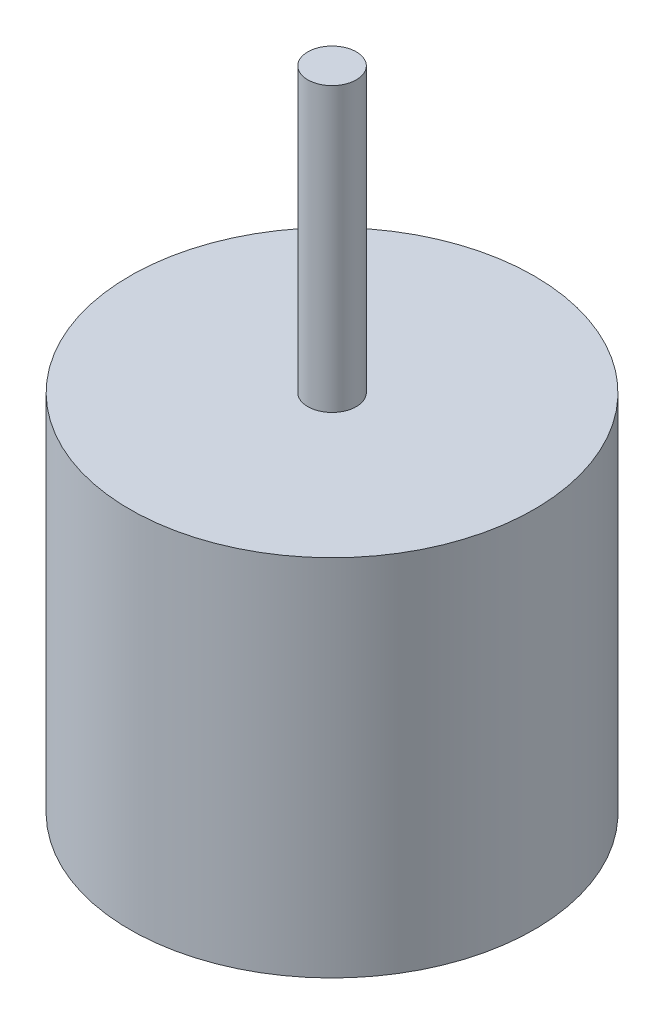
ISO-10303-21;
HEADER;
FILE_DESCRIPTION(('STEP AP214'),'2;1');
FILE_NAME('part.step','',(''),(''),'','','');
FILE_SCHEMA(('AUTOMOTIVE_DESIGN { 1 0 10303 214 1 1 1 1 }'));
ENDSEC;
DATA;
#1=APPLICATION_CONTEXT('core data for automotive mechanical design processes');
#2=APPLICATION_PROTOCOL_DEFINITION('international standard','automotive_design',2000,#1);
#3=PRODUCT_CONTEXT('',#1,'mechanical');
#4=PRODUCT('Part','Part','',(#3));
#5=PRODUCT_RELATED_PRODUCT_CATEGORY('part','',(#4));
#6=PRODUCT_DEFINITION_FORMATION('','',#4);
#7=PRODUCT_DEFINITION_CONTEXT('part definition',#1,'design');
#8=PRODUCT_DEFINITION('design','',#6,#7);
#9=PRODUCT_DEFINITION_SHAPE('','',#8);
#10=(LENGTH_UNIT() NAMED_UNIT(*) SI_UNIT(.MILLI.,.METRE.));
#11=(NAMED_UNIT(*) PLANE_ANGLE_UNIT() SI_UNIT($,.RADIAN.));
#12=(NAMED_UNIT(*) SI_UNIT($,.STERADIAN.) SOLID_ANGLE_UNIT());
#13=UNCERTAINTY_MEASURE_WITH_UNIT(LENGTH_MEASURE(1.E-05),#10,'distance_accuracy_value','');
#14=(GEOMETRIC_REPRESENTATION_CONTEXT(3) GLOBAL_UNCERTAINTY_ASSIGNED_CONTEXT((#13)) GLOBAL_UNIT_ASSIGNED_CONTEXT((#10,
#11,#12)) REPRESENTATION_CONTEXT('',''));
#15=CARTESIAN_POINT('',(0.,0.,0.));
#16=DIRECTION('',(0.,0.,1.));
#17=DIRECTION('',(1.,0.,0.));
#18=AXIS2_PLACEMENT_3D('',#15,#16,#17);
#19=CARTESIAN_POINT('',(0.,45.,0.));
#20=DIRECTION('',(0.,-1.,0.));
#21=DIRECTION('',(0.,0.,-1.));
#22=AXIS2_PLACEMENT_3D('',#19,#20,#21);
#23=CYLINDRICAL_SURFACE('',#22,25.);
#24=CARTESIAN_POINT('',(0.,45.,0.));
#25=DIRECTION('',(0.,1.,0.));
#26=DIRECTION('',(0.,0.,1.));
#27=AXIS2_PLACEMENT_3D('',#24,#25,#26);
#28=CIRCLE('',#27,25.);
#29=CARTESIAN_POINT('',(0.,45.,-25.));
#30=VERTEX_POINT('',#29);
#31=EDGE_CURVE('E10',#30,#30,#28,.T.);
#32=CARTESIAN_POINT('',(0.,0.,0.));
#33=DIRECTION('',(0.,1.,0.));
#34=DIRECTION('',(0.,0.,1.));
#35=AXIS2_PLACEMENT_3D('',#32,#33,#34);
#36=CIRCLE('',#35,25.);
#37=CARTESIAN_POINT('',(0.,0.,-25.));
#38=VERTEX_POINT('',#37);
#39=EDGE_CURVE('E40',#38,#38,#36,.T.);
#40=CARTESIAN_POINT('',(0.,45.,-25.));
#41=CARTESIAN_POINT('',(0.,44.53125,-25.));
#42=CARTESIAN_POINT('',(0.,44.0625,-25.));
#43=CARTESIAN_POINT('',(0.,43.125,-25.));
#44=CARTESIAN_POINT('',(0.,42.65625,-25.));
#45=CARTESIAN_POINT('',(0.,41.71875,-25.));
#46=CARTESIAN_POINT('',(0.,41.25,-25.));
#47=CARTESIAN_POINT('',(0.,40.3125,-25.));
#48=CARTESIAN_POINT('',(0.,39.84375,-25.));
#49=CARTESIAN_POINT('',(0.,38.90625,-25.));
#50=CARTESIAN_POINT('',(0.,38.4375,-25.));
#51=CARTESIAN_POINT('',(0.,37.5,-25.));
#52=CARTESIAN_POINT('',(0.,37.03125,-25.));
#53=CARTESIAN_POINT('',(0.,36.09375,-25.));
#54=CARTESIAN_POINT('',(0.,35.625,-25.));
#55=CARTESIAN_POINT('',(0.,34.6875,-25.));
#56=CARTESIAN_POINT('',(0.,34.21875,-25.));
#57=CARTESIAN_POINT('',(0.,33.28125,-25.));
#58=CARTESIAN_POINT('',(0.,32.8125,-25.));
#59=CARTESIAN_POINT('',(0.,31.875,-25.));
#60=CARTESIAN_POINT('',(0.,31.40625,-25.));
#61=CARTESIAN_POINT('',(0.,30.46875,-25.));
#62=CARTESIAN_POINT('',(0.,30.,-25.));
#63=CARTESIAN_POINT('',(0.,29.0625,-25.));
#64=CARTESIAN_POINT('',(0.,28.59375,-25.));
#65=CARTESIAN_POINT('',(0.,27.65625,-25.));
#66=CARTESIAN_POINT('',(0.,27.1875,-25.));
#67=CARTESIAN_POINT('',(0.,26.25,-25.));
#68=CARTESIAN_POINT('',(0.,25.78125,-25.));
#69=CARTESIAN_POINT('',(0.,24.84375,-25.));
#70=CARTESIAN_POINT('',(0.,24.375,-25.));
#71=CARTESIAN_POINT('',(0.,23.4375,-25.));
#72=CARTESIAN_POINT('',(0.,22.96875,-25.));
#73=CARTESIAN_POINT('',(0.,22.03125,-25.));
#74=CARTESIAN_POINT('',(0.,21.5625,-25.));
#75=CARTESIAN_POINT('',(0.,20.625,-25.));
#76=CARTESIAN_POINT('',(0.,20.15625,-25.));
#77=CARTESIAN_POINT('',(0.,19.21875,-25.));
#78=CARTESIAN_POINT('',(0.,18.75,-25.));
#79=CARTESIAN_POINT('',(0.,17.8125,-25.));
#80=CARTESIAN_POINT('',(0.,17.34375,-25.));
#81=CARTESIAN_POINT('',(0.,16.40625,-25.));
#82=CARTESIAN_POINT('',(0.,15.9375,-25.));
#83=CARTESIAN_POINT('',(0.,15.,-25.));
#84=CARTESIAN_POINT('',(0.,14.53125,-25.));
#85=CARTESIAN_POINT('',(0.,13.59375,-25.));
#86=CARTESIAN_POINT('',(0.,13.125,-25.));
#87=CARTESIAN_POINT('',(0.,12.1875,-25.));
#88=CARTESIAN_POINT('',(0.,11.71875,-25.));
#89=CARTESIAN_POINT('',(0.,10.78125,-25.));
#90=CARTESIAN_POINT('',(0.,10.3125,-25.));
#91=CARTESIAN_POINT('',(0.,9.37499999999999,-25.));
#92=CARTESIAN_POINT('',(0.,8.90624999999999,-25.));
#93=CARTESIAN_POINT('',(0.,7.96874999999999,-25.));
#94=CARTESIAN_POINT('',(0.,7.5,-25.));
#95=CARTESIAN_POINT('',(0.,6.56249999999999,-25.));
#96=CARTESIAN_POINT('',(0.,6.09374999999999,-25.));
#97=CARTESIAN_POINT('',(0.,5.15624999999999,-25.));
#98=CARTESIAN_POINT('',(0.,4.68749999999999,-25.));
#99=CARTESIAN_POINT('',(0.,3.74999999999999,-25.));
#100=CARTESIAN_POINT('',(0.,3.28124999999999,-25.));
#101=CARTESIAN_POINT('',(0.,2.34374999999999,-25.));
#102=CARTESIAN_POINT('',(0.,1.87499999999999,-25.));
#103=CARTESIAN_POINT('',(0.,0.937499999999992,-25.));
#104=CARTESIAN_POINT('',(0.,0.468749999999993,-25.));
#105=CARTESIAN_POINT('',(0.,0.,-25.));
#106=B_SPLINE_CURVE_WITH_KNOTS('',3,(#40,#41,#42,#43,#44,#45,#46,#47,#48,#49,#50,#51,#52,#53,
#54,#55,#56,#57,#58,#59,#60,#61,#62,#63,#64,#65,#66,#67,#68,#69,#70,#71,#72,#73,#74,#75,#76,#77,
#78,#79,#80,#81,#82,#83,#84,#85,#86,#87,#88,#89,#90,#91,#92,#93,#94,#95,#96,#97,#98,#99,#100,
#101,#102,#103,#104,#105),.UNSPECIFIED.,.F.,.F.,(4,2,2,2,2,2,2,2,2,2,2,2,2,2,2,2,2,2,2,2,2,2,2,
2,2,2,2,2,2,2,2,2,4),(0.,1.40625,2.8125,4.21874999999999,5.625,7.03125,8.43749999999999,9.84375,
11.25,12.65625,14.0625,15.46875,16.875,18.28125,19.6875,21.09375,22.5,23.90625,25.3125,26.71875,
28.125,29.53125,30.9375,32.34375,33.75,35.15625,36.5625,37.96875,39.375,40.78125,42.1875,
43.59375,45.),.UNSPECIFIED.);
#107=EDGE_CURVE('BSEAM37',#30,#38,#106,.T.);
#108=ORIENTED_EDGE('',*,*,#31,.F.);
#109=ORIENTED_EDGE('',*,*,#39,.T.);
#110=ORIENTED_EDGE('',*,*,#107,.T.);
#111=ORIENTED_EDGE('',*,*,#107,.F.);
#112=EDGE_LOOP('',(#108,#110,#109,#111));
#113=FACE_BOUND('',#112,.T.);
#114=ADVANCED_FACE('F37',(#113),#23,.T.);
#115=CARTESIAN_POINT('',(0.,45.,0.));
#116=DIRECTION('',(0.,1.,0.));
#117=DIRECTION('',(0.,0.,1.));
#118=AXIS2_PLACEMENT_3D('',#115,#116,#117);
#119=PLANE('',#118);
#120=CARTESIAN_POINT('',(0.,45.,0.));
#121=DIRECTION('',(0.,1.,0.));
#122=DIRECTION('',(0.,0.,1.));
#123=AXIS2_PLACEMENT_3D('',#120,#121,#122);
#124=CIRCLE('',#123,3.);
#125=CARTESIAN_POINT('',(0.,45.,3.));
#126=VERTEX_POINT('',#125);
#127=EDGE_CURVE('E49',#126,#126,#124,.T.);
#128=ORIENTED_EDGE('',*,*,#127,.F.);
#129=EDGE_LOOP('',(#128));
#130=FACE_BOUND('',#129,.T.);
#131=ORIENTED_EDGE('',*,*,#31,.T.);
#132=EDGE_LOOP('',(#131));
#133=FACE_BOUND('',#132,.T.);
#134=ADVANCED_FACE('F64',(#130,#133),#119,.T.);
#135=CARTESIAN_POINT('',(0.,0.,0.));
#136=DIRECTION('',(0.,1.,0.));
#137=DIRECTION('',(0.,0.,1.));
#138=AXIS2_PLACEMENT_3D('',#135,#136,#137);
#139=PLANE('',#138);
#140=ORIENTED_EDGE('',*,*,#39,.F.);
#141=EDGE_LOOP('',(#140));
#142=FACE_BOUND('',#141,.T.);
#143=ADVANCED_FACE('F60',(#142),#139,.F.);
#144=CARTESIAN_POINT('',(0.,80.,0.));
#145=DIRECTION('',(0.,-1.,0.));
#146=DIRECTION('',(0.,0.,-1.));
#147=AXIS2_PLACEMENT_3D('',#144,#145,#146);
#148=CYLINDRICAL_SURFACE('',#147,3.);
#149=CARTESIAN_POINT('',(0.,80.,0.));
#150=DIRECTION('',(0.,1.,0.));
#151=DIRECTION('',(0.,0.,1.));
#152=AXIS2_PLACEMENT_3D('',#149,#150,#151);
#153=CIRCLE('',#152,3.);
#154=CARTESIAN_POINT('',(0.,80.,3.));
#155=VERTEX_POINT('',#154);
#156=EDGE_CURVE('E47',#155,#155,#153,.T.);
#157=ORIENTED_EDGE('',*,*,#156,.F.);
#158=EDGE_LOOP('',(#157));
#159=FACE_BOUND('',#158,.T.);
#160=ORIENTED_EDGE('',*,*,#127,.T.);
#161=EDGE_LOOP('',(#160));
#162=FACE_BOUND('',#161,.T.);
#163=ADVANCED_FACE('F57',(#159,#162),#148,.T.);
#164=CARTESIAN_POINT('',(0.,80.,0.));
#165=DIRECTION('',(0.,1.,0.));
#166=DIRECTION('',(0.,0.,1.));
#167=AXIS2_PLACEMENT_3D('',#164,#165,#166);
#168=PLANE('',#167);
#169=ORIENTED_EDGE('',*,*,#156,.T.);
#170=EDGE_LOOP('',(#169));
#171=FACE_BOUND('',#170,.T.);
#172=ADVANCED_FACE('F55',(#171),#168,.T.);
#173=CLOSED_SHELL('',(#114,#134,#143,#163,#172));
#174=MANIFOLD_SOLID_BREP('B2',#173);
#175=ADVANCED_BREP_SHAPE_REPRESENTATION('',(#18,#174),#14);
#176=SHAPE_DEFINITION_REPRESENTATION(#9,#175);
ENDSEC;
END-ISO-10303-21;
